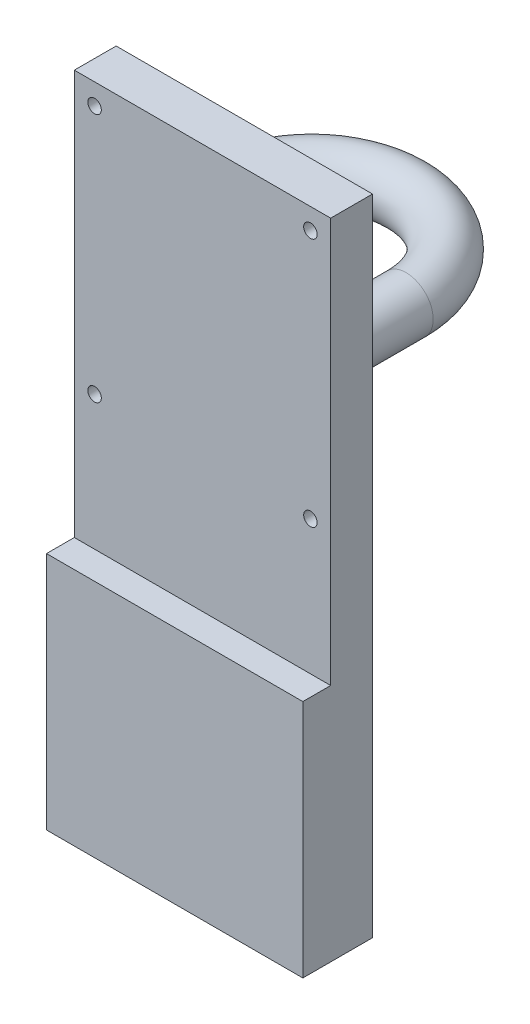
ISO-10303-21;
HEADER;
FILE_DESCRIPTION(('STEP AP214'),'2;1');
FILE_NAME('part.step','',(''),(''),'','','');
FILE_SCHEMA(('AUTOMOTIVE_DESIGN { 1 0 10303 214 1 1 1 1 }'));
ENDSEC;
DATA;
#1=APPLICATION_CONTEXT('core data for automotive mechanical design processes');
#2=APPLICATION_PROTOCOL_DEFINITION('international standard','automotive_design',2000,#1);
#3=PRODUCT_CONTEXT('',#1,'mechanical');
#4=PRODUCT('Part','Part','',(#3));
#5=PRODUCT_RELATED_PRODUCT_CATEGORY('part','',(#4));
#6=PRODUCT_DEFINITION_FORMATION('','',#4);
#7=PRODUCT_DEFINITION_CONTEXT('part definition',#1,'design');
#8=PRODUCT_DEFINITION('design','',#6,#7);
#9=PRODUCT_DEFINITION_SHAPE('','',#8);
#10=(LENGTH_UNIT() NAMED_UNIT(*) SI_UNIT(.MILLI.,.METRE.));
#11=(NAMED_UNIT(*) PLANE_ANGLE_UNIT() SI_UNIT($,.RADIAN.));
#12=(NAMED_UNIT(*) SI_UNIT($,.STERADIAN.) SOLID_ANGLE_UNIT());
#13=UNCERTAINTY_MEASURE_WITH_UNIT(LENGTH_MEASURE(1.E-05),#10,'distance_accuracy_value','');
#14=(GEOMETRIC_REPRESENTATION_CONTEXT(3) GLOBAL_UNCERTAINTY_ASSIGNED_CONTEXT((#13)) GLOBAL_UNIT_ASSIGNED_CONTEXT((#10,
#11,#12)) REPRESENTATION_CONTEXT('',''));
#15=CARTESIAN_POINT('',(0.,0.,0.));
#16=DIRECTION('',(0.,0.,1.));
#17=DIRECTION('',(1.,0.,0.));
#18=AXIS2_PLACEMENT_3D('',#15,#16,#17);
#19=CARTESIAN_POINT('',(0.,0.,31.));
#20=DIRECTION('',(1.,0.,0.));
#21=DIRECTION('',(0.,0.,-1.));
#22=AXIS2_PLACEMENT_3D('',#19,#20,#21);
#23=PLANE('',#22);
#24=DIRECTION('',(0.,-1.,0.));
#25=VECTOR('',#24,1.);
#26=CARTESIAN_POINT('',(0.,0.,0.));
#27=LINE('',#26,#25);
#28=CARTESIAN_POINT('',(0.,300.,0.));
#29=VERTEX_POINT('',#28);
#30=CARTESIAN_POINT('',(0.,-177.45,0.));
#31=VERTEX_POINT('',#30);
#32=EDGE_CURVE('E101',#29,#31,#27,.T.);
#33=ORIENTED_EDGE('',*,*,#32,.T.);
#34=DIRECTION('',(0.,0.,-1.));
#35=VECTOR('',#34,1.);
#36=CARTESIAN_POINT('',(0.,-177.45,0.));
#37=LINE('',#36,#35);
#38=CARTESIAN_POINT('',(0.,-177.45,51.62));
#39=VERTEX_POINT('',#38);
#40=EDGE_CURVE('E124',#39,#31,#37,.T.);
#41=ORIENTED_EDGE('',*,*,#40,.F.);
#42=DIRECTION('',(0.,1.,0.));
#43=VECTOR('',#42,1.);
#44=CARTESIAN_POINT('',(0.,-177.45,51.62));
#45=LINE('',#44,#43);
#46=CARTESIAN_POINT('',(0.,0.,51.62));
#47=VERTEX_POINT('',#46);
#48=EDGE_CURVE('E139',#39,#47,#45,.T.);
#49=ORIENTED_EDGE('',*,*,#48,.T.);
#50=DIRECTION('',(0.,0.,-1.));
#51=VECTOR('',#50,1.);
#52=CARTESIAN_POINT('',(0.,0.,0.));
#53=LINE('',#52,#51);
#54=CARTESIAN_POINT('',(0.,0.,31.));
#55=VERTEX_POINT('',#54);
#56=EDGE_CURVE('E88',#47,#55,#53,.T.);
#57=ORIENTED_EDGE('',*,*,#56,.T.);
#58=DIRECTION('',(0.,-1.,0.));
#59=VECTOR('',#58,1.);
#60=CARTESIAN_POINT('',(0.,0.,31.));
#61=LINE('',#60,#59);
#62=CARTESIAN_POINT('',(0.,300.,31.));
#63=VERTEX_POINT('',#62);
#64=EDGE_CURVE('E93',#63,#55,#61,.T.);
#65=ORIENTED_EDGE('',*,*,#64,.F.);
#66=DIRECTION('',(0.,0.,-1.));
#67=VECTOR('',#66,1.);
#68=CARTESIAN_POINT('',(0.,300.,31.));
#69=LINE('',#68,#67);
#70=EDGE_CURVE('E97',#63,#29,#69,.T.);
#71=ORIENTED_EDGE('',*,*,#70,.T.);
#72=EDGE_LOOP('',(#33,#41,#49,#57,#65,#71));
#73=FACE_BOUND('',#72,.T.);
#74=ADVANCED_FACE('F32',(#73),#23,.F.);
#75=CARTESIAN_POINT('',(190.,0.,31.));
#76=DIRECTION('',(-1.,0.,0.));
#77=DIRECTION('',(0.,0.,1.));
#78=AXIS2_PLACEMENT_3D('',#75,#76,#77);
#79=PLANE('',#78);
#80=DIRECTION('',(0.,1.,0.));
#81=VECTOR('',#80,1.);
#82=CARTESIAN_POINT('',(190.,0.,0.));
#83=LINE('',#82,#81);
#84=CARTESIAN_POINT('',(190.,-177.45,0.));
#85=VERTEX_POINT('',#84);
#86=CARTESIAN_POINT('',(190.,300.,0.));
#87=VERTEX_POINT('',#86);
#88=EDGE_CURVE('E60',#85,#87,#83,.T.);
#89=ORIENTED_EDGE('',*,*,#88,.T.);
#90=DIRECTION('',(0.,0.,-1.));
#91=VECTOR('',#90,1.);
#92=CARTESIAN_POINT('',(190.,300.,31.));
#93=LINE('',#92,#91);
#94=CARTESIAN_POINT('',(190.,300.,31.));
#95=VERTEX_POINT('',#94);
#96=EDGE_CURVE('E40',#95,#87,#93,.T.);
#97=ORIENTED_EDGE('',*,*,#96,.F.);
#98=DIRECTION('',(0.,1.,0.));
#99=VECTOR('',#98,1.);
#100=CARTESIAN_POINT('',(190.,0.,31.));
#101=LINE('',#100,#99);
#102=CARTESIAN_POINT('',(190.,0.,31.));
#103=VERTEX_POINT('',#102);
#104=EDGE_CURVE('E91',#103,#95,#101,.T.);
#105=ORIENTED_EDGE('',*,*,#104,.F.);
#106=DIRECTION('',(0.,0.,1.));
#107=VECTOR('',#106,1.);
#108=CARTESIAN_POINT('',(190.,0.,0.));
#109=LINE('',#108,#107);
#110=CARTESIAN_POINT('',(190.,0.,51.62));
#111=VERTEX_POINT('',#110);
#112=EDGE_CURVE('E80',#103,#111,#109,.T.);
#113=ORIENTED_EDGE('',*,*,#112,.T.);
#114=DIRECTION('',(0.,1.,0.));
#115=VECTOR('',#114,1.);
#116=CARTESIAN_POINT('',(190.,-177.45,51.62));
#117=LINE('',#116,#115);
#118=CARTESIAN_POINT('',(190.,-177.45,51.62));
#119=VERTEX_POINT('',#118);
#120=EDGE_CURVE('E136',#119,#111,#117,.T.);
#121=ORIENTED_EDGE('',*,*,#120,.F.);
#122=DIRECTION('',(0.,0.,1.));
#123=VECTOR('',#122,1.);
#124=CARTESIAN_POINT('',(190.,-177.45,0.));
#125=LINE('',#124,#123);
#126=EDGE_CURVE('E130',#85,#119,#125,.T.);
#127=ORIENTED_EDGE('',*,*,#126,.F.);
#128=EDGE_LOOP('',(#89,#97,#105,#113,#121,#127));
#129=FACE_BOUND('',#128,.T.);
#130=ADVANCED_FACE('F95',(#129),#79,.F.);
#131=CARTESIAN_POINT('',(0.,300.,31.));
#132=DIRECTION('',(0.,-1.,0.));
#133=DIRECTION('',(0.,0.,-1.));
#134=AXIS2_PLACEMENT_3D('',#131,#132,#133);
#135=PLANE('',#134);
#136=DIRECTION('',(-1.,0.,0.));
#137=VECTOR('',#136,1.);
#138=CARTESIAN_POINT('',(0.,300.,0.));
#139=LINE('',#138,#137);
#140=EDGE_CURVE('E106',#87,#29,#139,.T.);
#141=ORIENTED_EDGE('',*,*,#140,.T.);
#142=ORIENTED_EDGE('',*,*,#70,.F.);
#143=DIRECTION('',(-1.,0.,0.));
#144=VECTOR('',#143,1.);
#145=CARTESIAN_POINT('',(0.,300.,31.));
#146=LINE('',#145,#144);
#147=EDGE_CURVE('E48',#95,#63,#146,.T.);
#148=ORIENTED_EDGE('',*,*,#147,.F.);
#149=ORIENTED_EDGE('',*,*,#96,.T.);
#150=EDGE_LOOP('',(#141,#142,#148,#149));
#151=FACE_BOUND('',#150,.T.);
#152=ADVANCED_FACE('F111',(#151),#135,.F.);
#153=CARTESIAN_POINT('',(0.,0.,31.));
#154=DIRECTION('',(0.,0.,-1.));
#155=DIRECTION('',(-1.,0.,0.));
#156=AXIS2_PLACEMENT_3D('',#153,#154,#155);
#157=PLANE('',#156);
#158=CARTESIAN_POINT('',(15.,284.5,31.));
#159=DIRECTION('',(0.,0.,-1.));
#160=DIRECTION('',(-1.,0.,0.));
#161=AXIS2_PLACEMENT_3D('',#158,#159,#160);
#162=CIRCLE('',#161,5.);
#163=CARTESIAN_POINT('',(10.,284.5,31.));
#164=VERTEX_POINT('',#163);
#165=EDGE_CURVE('E155',#164,#164,#162,.T.);
#166=ORIENTED_EDGE('',*,*,#165,.T.);
#167=EDGE_LOOP('',(#166));
#168=FACE_BOUND('',#167,.T.);
#169=CARTESIAN_POINT('',(175.,99.5,31.));
#170=DIRECTION('',(0.,0.,-1.));
#171=DIRECTION('',(-1.,0.,0.));
#172=AXIS2_PLACEMENT_3D('',#169,#170,#171);
#173=CIRCLE('',#172,4.99999999999999);
#174=CARTESIAN_POINT('',(170.,99.5,31.));
#175=VERTEX_POINT('',#174);
#176=EDGE_CURVE('E162',#175,#175,#173,.T.);
#177=ORIENTED_EDGE('',*,*,#176,.T.);
#178=EDGE_LOOP('',(#177));
#179=FACE_BOUND('',#178,.T.);
#180=CARTESIAN_POINT('',(14.9999999999999,99.5,31.));
#181=DIRECTION('',(0.,0.,-1.));
#182=DIRECTION('',(-1.,0.,0.));
#183=AXIS2_PLACEMENT_3D('',#180,#181,#182);
#184=CIRCLE('',#183,5.);
#185=CARTESIAN_POINT('',(9.9999999999999,99.5,31.));
#186=VERTEX_POINT('',#185);
#187=EDGE_CURVE('E149',#186,#186,#184,.T.);
#188=ORIENTED_EDGE('',*,*,#187,.T.);
#189=EDGE_LOOP('',(#188));
#190=FACE_BOUND('',#189,.T.);
#191=CARTESIAN_POINT('',(175.,284.5,31.));
#192=DIRECTION('',(0.,0.,-1.));
#193=DIRECTION('',(-1.,0.,0.));
#194=AXIS2_PLACEMENT_3D('',#191,#192,#193);
#195=CIRCLE('',#194,4.99999999999999);
#196=CARTESIAN_POINT('',(170.,284.5,31.));
#197=VERTEX_POINT('',#196);
#198=EDGE_CURVE('E104',#197,#197,#195,.T.);
#199=ORIENTED_EDGE('',*,*,#198,.T.);
#200=EDGE_LOOP('',(#199));
#201=FACE_BOUND('',#200,.T.);
#202=ORIENTED_EDGE('',*,*,#64,.T.);
#203=DIRECTION('',(1.,0.,0.));
#204=VECTOR('',#203,1.);
#205=CARTESIAN_POINT('',(0.,0.,31.));
#206=LINE('',#205,#204);
#207=EDGE_CURVE('E70',#55,#103,#206,.T.);
#208=ORIENTED_EDGE('',*,*,#207,.T.);
#209=ORIENTED_EDGE('',*,*,#104,.T.);
#210=ORIENTED_EDGE('',*,*,#147,.T.);
#211=EDGE_LOOP('',(#202,#208,#209,#210));
#212=FACE_BOUND('',#211,.T.);
#213=ADVANCED_FACE('F90',(#168,#179,#190,#201,#212),#157,.F.);
#214=CARTESIAN_POINT('',(0.,0.,0.));
#215=DIRECTION('',(0.,0.,-1.));
#216=DIRECTION('',(-1.,0.,0.));
#217=AXIS2_PLACEMENT_3D('',#214,#215,#216);
#218=PLANE('',#217);
#219=CARTESIAN_POINT('',(25.,192.,0.));
#220=DIRECTION('',(0.,0.,-1.));
#221=DIRECTION('',(-1.,0.,0.));
#222=AXIS2_PLACEMENT_3D('',#219,#220,#221);
#223=CIRCLE('',#222,20.);
#224=CARTESIAN_POINT('',(5.00000000000001,192.,0.));
#225=VERTEX_POINT('',#224);
#226=EDGE_CURVE('E11',#225,#225,#223,.T.);
#227=ORIENTED_EDGE('',*,*,#226,.F.);
#228=EDGE_LOOP('',(#227));
#229=FACE_BOUND('',#228,.T.);
#230=CARTESIAN_POINT('',(165.,192.,0.));
#231=DIRECTION('',(0.,0.,-1.));
#232=DIRECTION('',(-1.,0.,0.));
#233=AXIS2_PLACEMENT_3D('',#230,#231,#232);
#234=CIRCLE('',#233,20.);
#235=CARTESIAN_POINT('',(145.,192.,0.));
#236=VERTEX_POINT('',#235);
#237=EDGE_CURVE('E314',#236,#236,#234,.T.);
#238=ORIENTED_EDGE('',*,*,#237,.F.);
#239=EDGE_LOOP('',(#238));
#240=FACE_BOUND('',#239,.T.);
#241=CARTESIAN_POINT('',(15.,284.5,0.));
#242=DIRECTION('',(0.,0.,-1.));
#243=DIRECTION('',(-1.,0.,0.));
#244=AXIS2_PLACEMENT_3D('',#241,#242,#243);
#245=CIRCLE('',#244,5.);
#246=CARTESIAN_POINT('',(10.,284.5,0.));
#247=VERTEX_POINT('',#246);
#248=EDGE_CURVE('E159',#247,#247,#245,.T.);
#249=ORIENTED_EDGE('',*,*,#248,.F.);
#250=EDGE_LOOP('',(#249));
#251=FACE_BOUND('',#250,.T.);
#252=CARTESIAN_POINT('',(175.,99.5,0.));
#253=DIRECTION('',(0.,0.,-1.));
#254=DIRECTION('',(-1.,0.,0.));
#255=AXIS2_PLACEMENT_3D('',#252,#253,#254);
#256=CIRCLE('',#255,4.99999999999999);
#257=CARTESIAN_POINT('',(170.,99.5,0.));
#258=VERTEX_POINT('',#257);
#259=EDGE_CURVE('E152',#258,#258,#256,.T.);
#260=ORIENTED_EDGE('',*,*,#259,.F.);
#261=EDGE_LOOP('',(#260));
#262=FACE_BOUND('',#261,.T.);
#263=CARTESIAN_POINT('',(14.9999999999999,99.5,0.));
#264=DIRECTION('',(0.,0.,-1.));
#265=DIRECTION('',(-1.,0.,0.));
#266=AXIS2_PLACEMENT_3D('',#263,#264,#265);
#267=CIRCLE('',#266,5.);
#268=CARTESIAN_POINT('',(9.9999999999999,99.5,0.));
#269=VERTEX_POINT('',#268);
#270=EDGE_CURVE('E138',#269,#269,#267,.T.);
#271=ORIENTED_EDGE('',*,*,#270,.F.);
#272=EDGE_LOOP('',(#271));
#273=FACE_BOUND('',#272,.T.);
#274=CARTESIAN_POINT('',(175.,284.5,0.));
#275=DIRECTION('',(0.,0.,-1.));
#276=DIRECTION('',(-1.,0.,0.));
#277=AXIS2_PLACEMENT_3D('',#274,#275,#276);
#278=CIRCLE('',#277,4.99999999999999);
#279=CARTESIAN_POINT('',(170.,284.5,0.));
#280=VERTEX_POINT('',#279);
#281=EDGE_CURVE('E158',#280,#280,#278,.T.);
#282=ORIENTED_EDGE('',*,*,#281,.F.);
#283=EDGE_LOOP('',(#282));
#284=FACE_BOUND('',#283,.T.);
#285=ORIENTED_EDGE('',*,*,#32,.F.);
#286=ORIENTED_EDGE('',*,*,#140,.F.);
#287=ORIENTED_EDGE('',*,*,#88,.F.);
#288=DIRECTION('',(1.,0.,0.));
#289=VECTOR('',#288,1.);
#290=CARTESIAN_POINT('',(0.,-177.45,0.));
#291=LINE('',#290,#289);
#292=EDGE_CURVE('E119',#31,#85,#291,.T.);
#293=ORIENTED_EDGE('',*,*,#292,.F.);
#294=EDGE_LOOP('',(#285,#286,#287,#293));
#295=FACE_BOUND('',#294,.T.);
#296=ADVANCED_FACE('F114',(#229,#240,#251,#262,#273,#284,#295),#218,.T.);
#297=CARTESIAN_POINT('',(175.,284.5,31.));
#298=DIRECTION('',(0.,0.,-1.));
#299=DIRECTION('',(-1.,0.,0.));
#300=AXIS2_PLACEMENT_3D('',#297,#298,#299);
#301=CYLINDRICAL_SURFACE('',#300,4.99999999999999);
#302=ORIENTED_EDGE('',*,*,#198,.F.);
#303=EDGE_LOOP('',(#302));
#304=FACE_BOUND('',#303,.T.);
#305=ORIENTED_EDGE('',*,*,#281,.T.);
#306=EDGE_LOOP('',(#305));
#307=FACE_BOUND('',#306,.T.);
#308=ADVANCED_FACE('F172',(#304,#307),#301,.F.);
#309=CARTESIAN_POINT('',(14.9999999999999,99.5,31.));
#310=DIRECTION('',(0.,0.,-1.));
#311=DIRECTION('',(-1.,0.,0.));
#312=AXIS2_PLACEMENT_3D('',#309,#310,#311);
#313=CYLINDRICAL_SURFACE('',#312,5.);
#314=ORIENTED_EDGE('',*,*,#187,.F.);
#315=EDGE_LOOP('',(#314));
#316=FACE_BOUND('',#315,.T.);
#317=ORIENTED_EDGE('',*,*,#270,.T.);
#318=EDGE_LOOP('',(#317));
#319=FACE_BOUND('',#318,.T.);
#320=ADVANCED_FACE('F182',(#316,#319),#313,.F.);
#321=CARTESIAN_POINT('',(175.,99.5,31.));
#322=DIRECTION('',(0.,0.,-1.));
#323=DIRECTION('',(-1.,0.,0.));
#324=AXIS2_PLACEMENT_3D('',#321,#322,#323);
#325=CYLINDRICAL_SURFACE('',#324,4.99999999999999);
#326=ORIENTED_EDGE('',*,*,#176,.F.);
#327=EDGE_LOOP('',(#326));
#328=FACE_BOUND('',#327,.T.);
#329=ORIENTED_EDGE('',*,*,#259,.T.);
#330=EDGE_LOOP('',(#329));
#331=FACE_BOUND('',#330,.T.);
#332=ADVANCED_FACE('F218',(#328,#331),#325,.F.);
#333=CARTESIAN_POINT('',(15.,284.5,31.));
#334=DIRECTION('',(0.,0.,-1.));
#335=DIRECTION('',(-1.,0.,0.));
#336=AXIS2_PLACEMENT_3D('',#333,#334,#335);
#337=CYLINDRICAL_SURFACE('',#336,5.);
#338=ORIENTED_EDGE('',*,*,#165,.F.);
#339=EDGE_LOOP('',(#338));
#340=FACE_BOUND('',#339,.T.);
#341=ORIENTED_EDGE('',*,*,#248,.T.);
#342=EDGE_LOOP('',(#341));
#343=FACE_BOUND('',#342,.T.);
#344=ADVANCED_FACE('F225',(#340,#343),#337,.F.);
#345=CARTESIAN_POINT('',(0.,0.,0.));
#346=DIRECTION('',(0.,1.,0.));
#347=DIRECTION('',(0.,0.,1.));
#348=AXIS2_PLACEMENT_3D('',#345,#346,#347);
#349=PLANE('',#348);
#350=ORIENTED_EDGE('',*,*,#207,.F.);
#351=ORIENTED_EDGE('',*,*,#56,.F.);
#352=DIRECTION('',(-1.,0.,0.));
#353=VECTOR('',#352,1.);
#354=CARTESIAN_POINT('',(0.,0.,51.62));
#355=LINE('',#354,#353);
#356=EDGE_CURVE('E84',#111,#47,#355,.T.);
#357=ORIENTED_EDGE('',*,*,#356,.F.);
#358=ORIENTED_EDGE('',*,*,#112,.F.);
#359=EDGE_LOOP('',(#350,#351,#357,#358));
#360=FACE_BOUND('',#359,.T.);
#361=ADVANCED_FACE('F81',(#360),#349,.T.);
#362=CARTESIAN_POINT('',(0.,-177.45,51.62));
#363=DIRECTION('',(0.,0.,-1.));
#364=DIRECTION('',(-1.,0.,0.));
#365=AXIS2_PLACEMENT_3D('',#362,#363,#364);
#366=PLANE('',#365);
#367=ORIENTED_EDGE('',*,*,#356,.T.);
#368=ORIENTED_EDGE('',*,*,#48,.F.);
#369=DIRECTION('',(-1.,0.,0.));
#370=VECTOR('',#369,1.);
#371=CARTESIAN_POINT('',(0.,-177.45,51.62));
#372=LINE('',#371,#370);
#373=EDGE_CURVE('E133',#119,#39,#372,.T.);
#374=ORIENTED_EDGE('',*,*,#373,.F.);
#375=ORIENTED_EDGE('',*,*,#120,.T.);
#376=EDGE_LOOP('',(#367,#368,#374,#375));
#377=FACE_BOUND('',#376,.T.);
#378=ADVANCED_FACE('F141',(#377),#366,.F.);
#379=CARTESIAN_POINT('',(0.,-177.45,0.));
#380=DIRECTION('',(0.,1.,0.));
#381=DIRECTION('',(0.,0.,1.));
#382=AXIS2_PLACEMENT_3D('',#379,#380,#381);
#383=PLANE('',#382);
#384=ORIENTED_EDGE('',*,*,#40,.T.);
#385=ORIENTED_EDGE('',*,*,#292,.T.);
#386=ORIENTED_EDGE('',*,*,#126,.T.);
#387=ORIENTED_EDGE('',*,*,#373,.T.);
#388=EDGE_LOOP('',(#384,#385,#386,#387));
#389=FACE_BOUND('',#388,.T.);
#390=ADVANCED_FACE('F131',(#389),#383,.F.);
#391=CARTESIAN_POINT('',(165.,192.,-50.));
#392=DIRECTION('',(0.,0.,1.));
#393=DIRECTION('',(1.,0.,0.));
#394=AXIS2_PLACEMENT_3D('',#391,#392,#393);
#395=CYLINDRICAL_SURFACE('',#394,20.);
#396=CARTESIAN_POINT('',(165.,192.,-50.));
#397=DIRECTION('',(0.,0.,-1.));
#398=DIRECTION('',(-1.,0.,0.));
#399=AXIS2_PLACEMENT_3D('',#396,#397,#398);
#400=CIRCLE('',#399,20.);
#401=CARTESIAN_POINT('',(185.,192.,-50.));
#402=VERTEX_POINT('',#401);
#403=EDGE_CURVE('E146',#402,#402,#400,.T.);
#404=ORIENTED_EDGE('',*,*,#403,.F.);
#405=EDGE_LOOP('',(#404));
#406=FACE_BOUND('',#405,.T.);
#407=ORIENTED_EDGE('',*,*,#237,.T.);
#408=EDGE_LOOP('',(#407));
#409=FACE_BOUND('',#408,.T.);
#410=ADVANCED_FACE('F275',(#406,#409),#395,.T.);
#411=CARTESIAN_POINT('',(25.,192.,-50.));
#412=DIRECTION('',(0.,0.,1.));
#413=DIRECTION('',(1.,0.,0.));
#414=AXIS2_PLACEMENT_3D('',#411,#412,#413);
#415=CYLINDRICAL_SURFACE('',#414,20.);
#416=CARTESIAN_POINT('',(25.,192.,-50.));
#417=DIRECTION('',(0.,0.,1.));
#418=DIRECTION('',(1.,0.,0.));
#419=AXIS2_PLACEMENT_3D('',#416,#417,#418);
#420=CIRCLE('',#419,20.);
#421=CARTESIAN_POINT('',(5.,192.,-50.));
#422=VERTEX_POINT('',#421);
#423=EDGE_CURVE('E311',#422,#422,#420,.T.);
#424=ORIENTED_EDGE('',*,*,#423,.T.);
#425=EDGE_LOOP('',(#424));
#426=FACE_BOUND('',#425,.T.);
#427=ORIENTED_EDGE('',*,*,#226,.T.);
#428=EDGE_LOOP('',(#427));
#429=FACE_BOUND('',#428,.T.);
#430=ADVANCED_FACE('F282',(#426,#429),#415,.T.);
#431=CARTESIAN_POINT('',(95.,192.,-50.));
#432=DIRECTION('',(0.,-1.,0.));
#433=DIRECTION('',(0.,0.,-1.));
#434=AXIS2_PLACEMENT_3D('',#431,#432,#433);
#435=TOROIDAL_SURFACE('',#434,70.,20.);
#436=CARTESIAN_POINT('',(95.,192.,-50.));
#437=DIRECTION('',(0.,-1.,0.));
#438=DIRECTION('',(0.,0.,-1.));
#439=AXIS2_PLACEMENT_3D('',#436,#437,#438);
#440=CIRCLE('',#439,90.);
#441=EDGE_CURVE('',#422,#402,#440,.T.);
#442=ORIENTED_EDGE('',*,*,#423,.F.);
#443=ORIENTED_EDGE('',*,*,#403,.T.);
#444=ORIENTED_EDGE('',*,*,#441,.T.);
#445=ORIENTED_EDGE('',*,*,#441,.F.);
#446=EDGE_LOOP('',(#442,#444,#443,#445));
#447=FACE_BOUND('',#446,.T.);
#448=ADVANCED_FACE('F291',(#447),#435,.T.);
#449=CLOSED_SHELL('',(#74,#130,#152,#213,#296,#308,#320,#332,#344,#361,#378,#390,#410,#430,#448));
#450=MANIFOLD_SOLID_BREP('B2',#449);
#451=ADVANCED_BREP_SHAPE_REPRESENTATION('',(#18,#450),#14);
#452=SHAPE_DEFINITION_REPRESENTATION(#9,#451);
ENDSEC;
END-ISO-10303-21;
